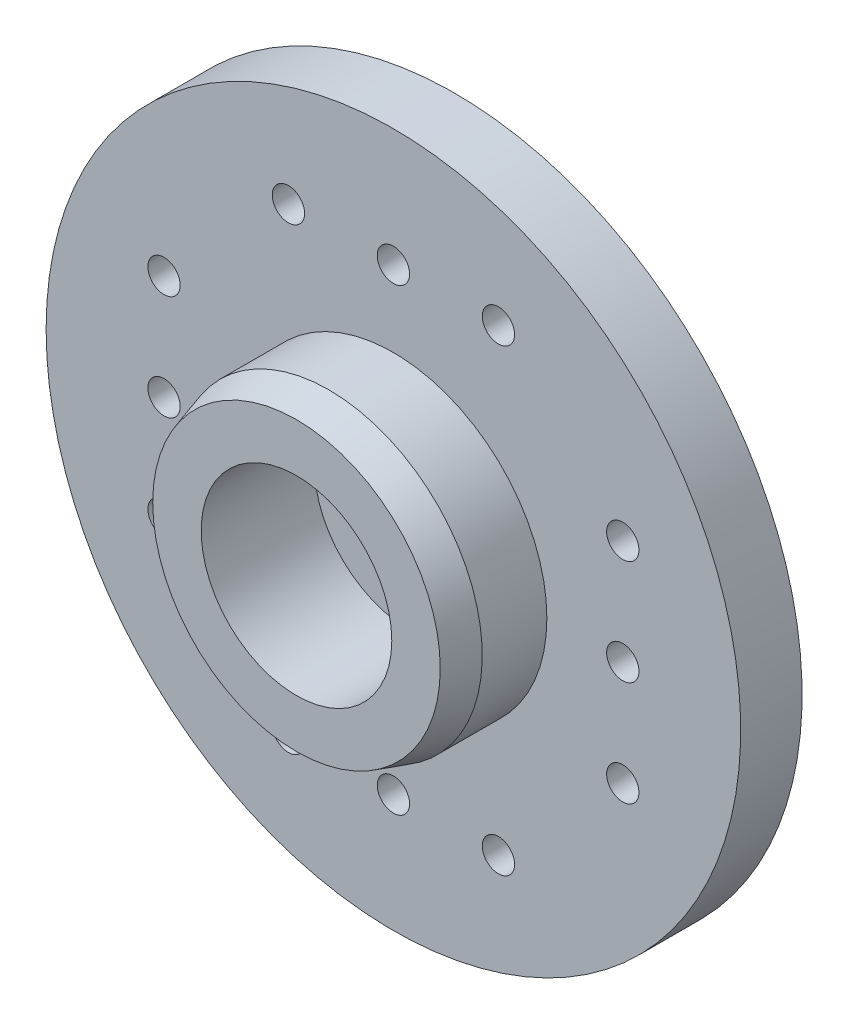
ISO-10303-21;
HEADER;
FILE_DESCRIPTION(('STEP AP214'),'2;1');
FILE_NAME('part.step','',(''),(''),'','','');
FILE_SCHEMA(('AUTOMOTIVE_DESIGN { 1 0 10303 214 1 1 1 1 }'));
ENDSEC;
DATA;
#1=APPLICATION_CONTEXT('core data for automotive mechanical design processes');
#2=APPLICATION_PROTOCOL_DEFINITION('international standard','automotive_design',2000,#1);
#3=PRODUCT_CONTEXT('',#1,'mechanical');
#4=PRODUCT('Part','Part','',(#3));
#5=PRODUCT_RELATED_PRODUCT_CATEGORY('part','',(#4));
#6=PRODUCT_DEFINITION_FORMATION('','',#4);
#7=PRODUCT_DEFINITION_CONTEXT('part definition',#1,'design');
#8=PRODUCT_DEFINITION('design','',#6,#7);
#9=PRODUCT_DEFINITION_SHAPE('','',#8);
#10=(LENGTH_UNIT() NAMED_UNIT(*) SI_UNIT(.MILLI.,.METRE.));
#11=(NAMED_UNIT(*) PLANE_ANGLE_UNIT() SI_UNIT($,.RADIAN.));
#12=(NAMED_UNIT(*) SI_UNIT($,.STERADIAN.) SOLID_ANGLE_UNIT());
#13=UNCERTAINTY_MEASURE_WITH_UNIT(LENGTH_MEASURE(1.E-05),#10,'distance_accuracy_value','');
#14=(GEOMETRIC_REPRESENTATION_CONTEXT(3) GLOBAL_UNCERTAINTY_ASSIGNED_CONTEXT((#13)) GLOBAL_UNIT_ASSIGNED_CONTEXT((#10,
#11,#12)) REPRESENTATION_CONTEXT('',''));
#15=CARTESIAN_POINT('',(0.,0.,0.));
#16=DIRECTION('',(0.,0.,1.));
#17=DIRECTION('',(1.,0.,0.));
#18=AXIS2_PLACEMENT_3D('',#15,#16,#17);
#19=CARTESIAN_POINT('',(0.,0.,4.9));
#20=DIRECTION('',(0.,0.,-1.));
#21=DIRECTION('',(-1.,0.,0.));
#22=AXIS2_PLACEMENT_3D('',#19,#20,#21);
#23=CYLINDRICAL_SURFACE('',#22,1.45);
#24=CARTESIAN_POINT('',(0.,0.,1.4));
#25=DIRECTION('',(0.,0.,-1.));
#26=DIRECTION('',(-1.,0.,0.));
#27=AXIS2_PLACEMENT_3D('',#24,#25,#26);
#28=CIRCLE('',#27,1.45);
#29=CARTESIAN_POINT('',(-1.45,0.,1.4));
#30=VERTEX_POINT('',#29);
#31=EDGE_CURVE('E18',#30,#30,#28,.T.);
#32=ORIENTED_EDGE('',*,*,#31,.F.);
#33=EDGE_LOOP('',(#32));
#34=FACE_BOUND('',#33,.T.);
#35=CARTESIAN_POINT('',(0.,0.,0.));
#36=DIRECTION('',(0.,0.,-1.));
#37=DIRECTION('',(-1.,0.,0.));
#38=AXIS2_PLACEMENT_3D('',#35,#36,#37);
#39=CIRCLE('',#38,1.45);
#40=CARTESIAN_POINT('',(-1.45,0.,0.));
#41=VERTEX_POINT('',#40);
#42=EDGE_CURVE('E132',#41,#41,#39,.T.);
#43=ORIENTED_EDGE('',*,*,#42,.T.);
#44=EDGE_LOOP('',(#43));
#45=FACE_BOUND('',#44,.T.);
#46=ADVANCED_FACE('F15',(#34,#45),#23,.F.);
#47=CARTESIAN_POINT('',(0.,0.,1.4));
#48=DIRECTION('',(0.,0.,1.));
#49=DIRECTION('',(1.,0.,0.));
#50=AXIS2_PLACEMENT_3D('',#47,#48,#49);
#51=PLANE('',#50);
#52=CARTESIAN_POINT('',(0.,0.,1.4));
#53=DIRECTION('',(0.,0.,1.));
#54=DIRECTION('',(1.,0.,0.));
#55=AXIS2_PLACEMENT_3D('',#52,#53,#54);
#56=CIRCLE('',#55,2.95);
#57=CARTESIAN_POINT('',(2.95,0.,1.4));
#58=VERTEX_POINT('',#57);
#59=EDGE_CURVE('E130',#58,#58,#56,.T.);
#60=ORIENTED_EDGE('',*,*,#59,.T.);
#61=EDGE_LOOP('',(#60));
#62=FACE_BOUND('',#61,.T.);
#63=ORIENTED_EDGE('',*,*,#31,.T.);
#64=EDGE_LOOP('',(#63));
#65=FACE_BOUND('',#64,.T.);
#66=ADVANCED_FACE('F139',(#62,#65),#51,.T.);
#67=CARTESIAN_POINT('',(0.,0.,0.));
#68=DIRECTION('',(0.,0.,1.));
#69=DIRECTION('',(1.,0.,0.));
#70=AXIS2_PLACEMENT_3D('',#67,#68,#69);
#71=PLANE('',#70);
#72=CARTESIAN_POINT('',(0.,0.,0.));
#73=DIRECTION('',(0.,0.,1.));
#74=DIRECTION('',(1.,0.,0.));
#75=AXIS2_PLACEMENT_3D('',#72,#73,#74);
#76=CIRCLE('',#75,2.75);
#77=CARTESIAN_POINT('',(2.75,0.,0.));
#78=VERTEX_POINT('',#77);
#79=EDGE_CURVE('E127',#78,#78,#76,.F.);
#80=ORIENTED_EDGE('',*,*,#79,.T.);
#81=EDGE_LOOP('',(#80));
#82=FACE_BOUND('',#81,.T.);
#83=ORIENTED_EDGE('',*,*,#42,.F.);
#84=EDGE_LOOP('',(#83));
#85=FACE_BOUND('',#84,.T.);
#86=ADVANCED_FACE('F146',(#82,#85),#71,.F.);
#87=CARTESIAN_POINT('',(0.,0.,1.4));
#88=DIRECTION('',(0.,0.,1.));
#89=DIRECTION('',(1.,0.,0.));
#90=AXIS2_PLACEMENT_3D('',#87,#88,#89);
#91=CYLINDRICAL_SURFACE('',#90,2.95);
#92=CARTESIAN_POINT('',(0.,0.,4.9));
#93=DIRECTION('',(0.,0.,1.));
#94=DIRECTION('',(1.,0.,0.));
#95=AXIS2_PLACEMENT_3D('',#92,#93,#94);
#96=CIRCLE('',#95,2.95);
#97=CARTESIAN_POINT('',(2.95,0.,4.9));
#98=VERTEX_POINT('',#97);
#99=EDGE_CURVE('E124',#98,#98,#96,.F.);
#100=ORIENTED_EDGE('',*,*,#99,.F.);
#101=EDGE_LOOP('',(#100));
#102=FACE_BOUND('',#101,.T.);
#103=ORIENTED_EDGE('',*,*,#59,.F.);
#104=EDGE_LOOP('',(#103));
#105=FACE_BOUND('',#104,.T.);
#106=ADVANCED_FACE('F242',(#102,#105),#91,.F.);
#107=CARTESIAN_POINT('',(0.,0.,-1.));
#108=DIRECTION('',(0.,0.,1.));
#109=DIRECTION('',(1.,0.,0.));
#110=AXIS2_PLACEMENT_3D('',#107,#108,#109);
#111=CYLINDRICAL_SURFACE('',#110,2.75);
#112=CARTESIAN_POINT('',(0.,0.,-1.));
#113=DIRECTION('',(0.,0.,1.));
#114=DIRECTION('',(1.,0.,0.));
#115=AXIS2_PLACEMENT_3D('',#112,#113,#114);
#116=CIRCLE('',#115,2.75);
#117=CARTESIAN_POINT('',(2.75,0.,-1.));
#118=VERTEX_POINT('',#117);
#119=EDGE_CURVE('E121',#118,#118,#116,.T.);
#120=ORIENTED_EDGE('',*,*,#119,.F.);
#121=EDGE_LOOP('',(#120));
#122=FACE_BOUND('',#121,.T.);
#123=ORIENTED_EDGE('',*,*,#79,.F.);
#124=EDGE_LOOP('',(#123));
#125=FACE_BOUND('',#124,.T.);
#126=ADVANCED_FACE('F238',(#122,#125),#111,.F.);
#127=CARTESIAN_POINT('',(0.,0.,4.9));
#128=DIRECTION('',(0.,0.,1.));
#129=DIRECTION('',(1.,0.,0.));
#130=AXIS2_PLACEMENT_3D('',#127,#128,#129);
#131=PLANE('',#130);
#132=CARTESIAN_POINT('',(0.,0.,4.89999999996371));
#133=DIRECTION('',(0.,0.,-1.));
#134=DIRECTION('',(0.,1.,0.));
#135=AXIS2_PLACEMENT_3D('',#132,#133,#134);
#136=CIRCLE('',#135,4.44999999999141);
#137=CARTESIAN_POINT('',(0.,4.44999999999141,4.89999999996371));
#138=VERTEX_POINT('',#137);
#139=EDGE_CURVE('E118',#138,#138,#136,.T.);
#140=ORIENTED_EDGE('',*,*,#139,.F.);
#141=EDGE_LOOP('',(#140));
#142=FACE_BOUND('',#141,.T.);
#143=ORIENTED_EDGE('',*,*,#99,.T.);
#144=EDGE_LOOP('',(#143));
#145=FACE_BOUND('',#144,.T.);
#146=ADVANCED_FACE('F234',(#142,#145),#131,.T.);
#147=CARTESIAN_POINT('',(0.,0.,-1.));
#148=DIRECTION('',(0.,0.,-1.));
#149=DIRECTION('',(-1.,0.,0.));
#150=AXIS2_PLACEMENT_3D('',#147,#148,#149);
#151=PLANE('',#150);
#152=ORIENTED_EDGE('',*,*,#119,.T.);
#153=EDGE_LOOP('',(#152));
#154=FACE_BOUND('',#153,.T.);
#155=CARTESIAN_POINT('',(0.,0.,-1.));
#156=DIRECTION('',(0.,0.,1.));
#157=DIRECTION('',(1.,0.,0.));
#158=AXIS2_PLACEMENT_3D('',#155,#156,#157);
#159=CIRCLE('',#158,3.25);
#160=CARTESIAN_POINT('',(3.25,0.,-1.));
#161=VERTEX_POINT('',#160);
#162=EDGE_CURVE('E115',#161,#161,#159,.T.);
#163=ORIENTED_EDGE('',*,*,#162,.F.);
#164=EDGE_LOOP('',(#163));
#165=FACE_BOUND('',#164,.T.);
#166=ADVANCED_FACE('F230',(#154,#165),#151,.T.);
#167=CARTESIAN_POINT('',(0.,0.,3.89999999998736));
#168=DIRECTION('',(0.,0.,-1.));
#169=DIRECTION('',(0.,1.,0.));
#170=AXIS2_PLACEMENT_3D('',#167,#168,#169);
#171=CONICAL_SURFACE('',#170,4.75000000000136,0.291456794493512);
#172=CARTESIAN_POINT('',(0.,0.,3.9));
#173=DIRECTION('',(0.,0.,-1.));
#174=DIRECTION('',(-1.,0.,0.));
#175=AXIS2_PLACEMENT_3D('',#172,#173,#174);
#176=CIRCLE('',#175,4.75);
#177=CARTESIAN_POINT('',(-4.75,0.,3.9));
#178=VERTEX_POINT('',#177);
#179=EDGE_CURVE('E30',#178,#178,#176,.T.);
#180=ORIENTED_EDGE('',*,*,#179,.F.);
#181=EDGE_LOOP('',(#180));
#182=FACE_BOUND('',#181,.T.);
#183=ORIENTED_EDGE('',*,*,#139,.T.);
#184=EDGE_LOOP('',(#183));
#185=FACE_BOUND('',#184,.T.);
#186=ADVANCED_FACE('F226',(#182,#185),#171,.T.);
#187=CARTESIAN_POINT('',(0.,0.,-1.));
#188=DIRECTION('',(0.,0.,1.));
#189=DIRECTION('',(1.,0.,0.));
#190=AXIS2_PLACEMENT_3D('',#187,#188,#189);
#191=CYLINDRICAL_SURFACE('',#190,3.25);
#192=CARTESIAN_POINT('',(0.,0.,0.4));
#193=DIRECTION('',(0.,0.,1.));
#194=DIRECTION('',(1.,0.,0.));
#195=AXIS2_PLACEMENT_3D('',#192,#193,#194);
#196=CIRCLE('',#195,3.25);
#197=CARTESIAN_POINT('',(3.25,0.,0.4));
#198=VERTEX_POINT('',#197);
#199=EDGE_CURVE('E112',#198,#198,#196,.T.);
#200=ORIENTED_EDGE('',*,*,#199,.F.);
#201=EDGE_LOOP('',(#200));
#202=FACE_BOUND('',#201,.T.);
#203=ORIENTED_EDGE('',*,*,#162,.T.);
#204=EDGE_LOOP('',(#203));
#205=FACE_BOUND('',#204,.T.);
#206=ADVANCED_FACE('F222',(#202,#205),#191,.T.);
#207=CARTESIAN_POINT('',(0.,0.,4.9));
#208=DIRECTION('',(0.,0.,-1.));
#209=DIRECTION('',(-1.,0.,0.));
#210=AXIS2_PLACEMENT_3D('',#207,#208,#209);
#211=CYLINDRICAL_SURFACE('',#210,4.75);
#212=CARTESIAN_POINT('',(0.,0.,1.9));
#213=DIRECTION('',(0.,0.,-1.));
#214=DIRECTION('',(-1.,0.,0.));
#215=AXIS2_PLACEMENT_3D('',#212,#213,#214);
#216=CIRCLE('',#215,4.75);
#217=CARTESIAN_POINT('',(-4.75,0.,1.9));
#218=VERTEX_POINT('',#217);
#219=EDGE_CURVE('E109',#218,#218,#216,.T.);
#220=ORIENTED_EDGE('',*,*,#219,.F.);
#221=EDGE_LOOP('',(#220));
#222=FACE_BOUND('',#221,.T.);
#223=ORIENTED_EDGE('',*,*,#179,.T.);
#224=EDGE_LOOP('',(#223));
#225=FACE_BOUND('',#224,.T.);
#226=ADVANCED_FACE('F218',(#222,#225),#211,.T.);
#227=CARTESIAN_POINT('',(0.,0.,0.4));
#228=DIRECTION('',(0.,0.,-1.));
#229=DIRECTION('',(-1.,0.,0.));
#230=AXIS2_PLACEMENT_3D('',#227,#228,#229);
#231=PLANE('',#230);
#232=CARTESIAN_POINT('',(0.,0.,0.4));
#233=DIRECTION('',(0.,0.,-1.));
#234=DIRECTION('',(-1.,0.,0.));
#235=AXIS2_PLACEMENT_3D('',#232,#233,#234);
#236=CIRCLE('',#235,4.25);
#237=CARTESIAN_POINT('',(-4.25,0.,0.4));
#238=VERTEX_POINT('',#237);
#239=EDGE_CURVE('E106',#238,#238,#236,.T.);
#240=ORIENTED_EDGE('',*,*,#239,.T.);
#241=EDGE_LOOP('',(#240));
#242=FACE_BOUND('',#241,.T.);
#243=ORIENTED_EDGE('',*,*,#199,.T.);
#244=EDGE_LOOP('',(#243));
#245=FACE_BOUND('',#244,.T.);
#246=ADVANCED_FACE('F214',(#242,#245),#231,.T.);
#247=CARTESIAN_POINT('',(0.,0.,1.9));
#248=DIRECTION('',(0.,0.,1.));
#249=DIRECTION('',(1.,0.,0.));
#250=AXIS2_PLACEMENT_3D('',#247,#248,#249);
#251=PLANE('',#250);
#252=ORIENTED_EDGE('',*,*,#219,.T.);
#253=EDGE_LOOP('',(#252));
#254=FACE_BOUND('',#253,.T.);
#255=CARTESIAN_POINT('',(-7.09999999999931,-5.14309428378815E-13,1.9));
#256=DIRECTION('',(0.,0.,-1.));
#257=DIRECTION('',(-1.,0.,0.));
#258=AXIS2_PLACEMENT_3D('',#255,#256,#257);
#259=CIRCLE('',#258,0.5);
#260=CARTESIAN_POINT('',(-7.59999999999931,-5.14309428378815E-13,1.9));
#261=VERTEX_POINT('',#260);
#262=EDGE_CURVE('E103',#261,#261,#259,.T.);
#263=ORIENTED_EDGE('',*,*,#262,.T.);
#264=EDGE_LOOP('',(#263));
#265=FACE_BOUND('',#264,.T.);
#266=CARTESIAN_POINT('',(-3.24999999999879,-7.09999999999982,1.9));
#267=DIRECTION('',(0.,0.,-1.));
#268=DIRECTION('',(-1.,0.,0.));
#269=AXIS2_PLACEMENT_3D('',#266,#267,#268);
#270=CIRCLE('',#269,0.5);
#271=CARTESIAN_POINT('',(-3.74999999999879,-7.09999999999982,1.9));
#272=VERTEX_POINT('',#271);
#273=EDGE_CURVE('E100',#272,#272,#270,.T.);
#274=ORIENTED_EDGE('',*,*,#273,.T.);
#275=EDGE_LOOP('',(#274));
#276=FACE_BOUND('',#275,.T.);
#277=CARTESIAN_POINT('',(3.25000000000121,-7.09999999999982,1.9));
#278=DIRECTION('',(0.,0.,-1.));
#279=DIRECTION('',(-1.,0.,0.));
#280=AXIS2_PLACEMENT_3D('',#277,#278,#279);
#281=CIRCLE('',#280,0.5);
#282=CARTESIAN_POINT('',(2.75000000000121,-7.09999999999982,1.9));
#283=VERTEX_POINT('',#282);
#284=EDGE_CURVE('E97',#283,#283,#281,.T.);
#285=ORIENTED_EDGE('',*,*,#284,.T.);
#286=EDGE_LOOP('',(#285));
#287=FACE_BOUND('',#286,.T.);
#288=CARTESIAN_POINT('',(7.10000000000051,6.95585894128985E-13,1.9));
#289=DIRECTION('',(0.,0.,-1.));
#290=DIRECTION('',(-1.,0.,0.));
#291=AXIS2_PLACEMENT_3D('',#288,#289,#290);
#292=CIRCLE('',#291,0.5);
#293=CARTESIAN_POINT('',(6.60000000000051,6.95585894128985E-13,1.9));
#294=VERTEX_POINT('',#293);
#295=EDGE_CURVE('E94',#294,#294,#292,.T.);
#296=ORIENTED_EDGE('',*,*,#295,.T.);
#297=EDGE_LOOP('',(#296));
#298=FACE_BOUND('',#297,.T.);
#299=CARTESIAN_POINT('',(3.25,7.1,1.9));
#300=DIRECTION('',(0.,0.,-1.));
#301=DIRECTION('',(-1.,0.,0.));
#302=AXIS2_PLACEMENT_3D('',#299,#300,#301);
#303=CIRCLE('',#302,0.5);
#304=CARTESIAN_POINT('',(2.75,7.1,1.9));
#305=VERTEX_POINT('',#304);
#306=EDGE_CURVE('E91',#305,#305,#303,.T.);
#307=ORIENTED_EDGE('',*,*,#306,.T.);
#308=EDGE_LOOP('',(#307));
#309=FACE_BOUND('',#308,.T.);
#310=CARTESIAN_POINT('',(-3.25,7.1,1.9));
#311=DIRECTION('',(0.,0.,-1.));
#312=DIRECTION('',(-1.,0.,0.));
#313=AXIS2_PLACEMENT_3D('',#310,#311,#312);
#314=CIRCLE('',#313,0.5);
#315=CARTESIAN_POINT('',(-3.75,7.1,1.9));
#316=VERTEX_POINT('',#315);
#317=EDGE_CURVE('E88',#316,#316,#314,.T.);
#318=ORIENTED_EDGE('',*,*,#317,.T.);
#319=EDGE_LOOP('',(#318));
#320=FACE_BOUND('',#319,.T.);
#321=CARTESIAN_POINT('',(0.,0.,1.9));
#322=DIRECTION('',(0.,0.,-1.));
#323=DIRECTION('',(-1.,0.,0.));
#324=AXIS2_PLACEMENT_3D('',#321,#322,#323);
#325=CIRCLE('',#324,10.75);
#326=CARTESIAN_POINT('',(-10.75,0.,1.9));
#327=VERTEX_POINT('',#326);
#328=EDGE_CURVE('E85',#327,#327,#325,.T.);
#329=ORIENTED_EDGE('',*,*,#328,.F.);
#330=EDGE_LOOP('',(#329));
#331=FACE_BOUND('',#330,.T.);
#332=CARTESIAN_POINT('',(0.,7.1,1.9));
#333=DIRECTION('',(0.,0.,-1.));
#334=DIRECTION('',(-1.,0.,0.));
#335=AXIS2_PLACEMENT_3D('',#332,#333,#334);
#336=CIRCLE('',#335,0.5);
#337=CARTESIAN_POINT('',(-0.5,7.1,1.9));
#338=VERTEX_POINT('',#337);
#339=EDGE_CURVE('E82',#338,#338,#336,.T.);
#340=ORIENTED_EDGE('',*,*,#339,.T.);
#341=EDGE_LOOP('',(#340));
#342=FACE_BOUND('',#341,.T.);
#343=CARTESIAN_POINT('',(7.10000000000051,3.2500000000007,1.9));
#344=DIRECTION('',(0.,0.,-1.));
#345=DIRECTION('',(-1.,0.,0.));
#346=AXIS2_PLACEMENT_3D('',#343,#344,#345);
#347=CIRCLE('',#346,0.5);
#348=CARTESIAN_POINT('',(6.60000000000051,3.2500000000007,1.9));
#349=VERTEX_POINT('',#348);
#350=EDGE_CURVE('E79',#349,#349,#347,.T.);
#351=ORIENTED_EDGE('',*,*,#350,.T.);
#352=EDGE_LOOP('',(#351));
#353=FACE_BOUND('',#352,.T.);
#354=CARTESIAN_POINT('',(7.10000000000051,-3.2499999999993,1.9));
#355=DIRECTION('',(0.,0.,-1.));
#356=DIRECTION('',(-1.,0.,0.));
#357=AXIS2_PLACEMENT_3D('',#354,#355,#356);
#358=CIRCLE('',#357,0.5);
#359=CARTESIAN_POINT('',(6.60000000000051,-3.2499999999993,1.9));
#360=VERTEX_POINT('',#359);
#361=EDGE_CURVE('E76',#360,#360,#358,.T.);
#362=ORIENTED_EDGE('',*,*,#361,.T.);
#363=EDGE_LOOP('',(#362));
#364=FACE_BOUND('',#363,.T.);
#365=CARTESIAN_POINT('',(1.20902582328041E-12,-7.09999999999982,1.9));
#366=DIRECTION('',(0.,0.,-1.));
#367=DIRECTION('',(-1.,0.,0.));
#368=AXIS2_PLACEMENT_3D('',#365,#366,#367);
#369=CIRCLE('',#368,0.5);
#370=CARTESIAN_POINT('',(-0.499999999998791,-7.09999999999982,1.9));
#371=VERTEX_POINT('',#370);
#372=EDGE_CURVE('E73',#371,#371,#369,.T.);
#373=ORIENTED_EDGE('',*,*,#372,.T.);
#374=EDGE_LOOP('',(#373));
#375=FACE_BOUND('',#374,.T.);
#376=CARTESIAN_POINT('',(-7.0999999999993,-3.25000000000051,1.9));
#377=DIRECTION('',(0.,0.,-1.));
#378=DIRECTION('',(-1.,0.,0.));
#379=AXIS2_PLACEMENT_3D('',#376,#377,#378);
#380=CIRCLE('',#379,0.5);
#381=CARTESIAN_POINT('',(-7.5999999999993,-3.25000000000051,1.9));
#382=VERTEX_POINT('',#381);
#383=EDGE_CURVE('E70',#382,#382,#380,.T.);
#384=ORIENTED_EDGE('',*,*,#383,.T.);
#385=EDGE_LOOP('',(#384));
#386=FACE_BOUND('',#385,.T.);
#387=CARTESIAN_POINT('',(-7.09999999999931,3.24999999999949,1.9));
#388=DIRECTION('',(0.,0.,-1.));
#389=DIRECTION('',(-1.,0.,0.));
#390=AXIS2_PLACEMENT_3D('',#387,#388,#389);
#391=CIRCLE('',#390,0.5);
#392=CARTESIAN_POINT('',(-7.59999999999931,3.24999999999949,1.9));
#393=VERTEX_POINT('',#392);
#394=EDGE_CURVE('E67',#393,#393,#391,.T.);
#395=ORIENTED_EDGE('',*,*,#394,.T.);
#396=EDGE_LOOP('',(#395));
#397=FACE_BOUND('',#396,.T.);
#398=ADVANCED_FACE('F210',(#254,#265,#276,#287,#298,#309,#320,#331,#342,#353,#364,#375,#386,
#397),#251,.T.);
#399=CARTESIAN_POINT('',(0.,0.,0.4));
#400=DIRECTION('',(0.,0.,-1.));
#401=DIRECTION('',(-1.,0.,0.));
#402=AXIS2_PLACEMENT_3D('',#399,#400,#401);
#403=CYLINDRICAL_SURFACE('',#402,4.25);
#404=ORIENTED_EDGE('',*,*,#239,.F.);
#405=EDGE_LOOP('',(#404));
#406=FACE_BOUND('',#405,.T.);
#407=CARTESIAN_POINT('',(0.,0.,0.));
#408=DIRECTION('',(0.,0.,-1.));
#409=DIRECTION('',(-1.,0.,0.));
#410=AXIS2_PLACEMENT_3D('',#407,#408,#409);
#411=CIRCLE('',#410,4.25);
#412=CARTESIAN_POINT('',(-4.25,0.,0.));
#413=VERTEX_POINT('',#412);
#414=EDGE_CURVE('E64',#413,#413,#411,.T.);
#415=ORIENTED_EDGE('',*,*,#414,.T.);
#416=EDGE_LOOP('',(#415));
#417=FACE_BOUND('',#416,.T.);
#418=ADVANCED_FACE('F206',(#406,#417),#403,.F.);
#419=CARTESIAN_POINT('',(-7.09999999999931,-5.14309428378815E-13,1.9));
#420=DIRECTION('',(0.,0.,-1.));
#421=DIRECTION('',(-1.,0.,0.));
#422=AXIS2_PLACEMENT_3D('',#419,#420,#421);
#423=CYLINDRICAL_SURFACE('',#422,0.5);
#424=CARTESIAN_POINT('',(-7.09999999999931,-5.14309428378815E-13,0.));
#425=DIRECTION('',(0.,0.,-1.));
#426=DIRECTION('',(-1.,0.,0.));
#427=AXIS2_PLACEMENT_3D('',#424,#425,#426);
#428=CIRCLE('',#427,0.5);
#429=CARTESIAN_POINT('',(-7.59999999999931,-5.14309428378815E-13,0.));
#430=VERTEX_POINT('',#429);
#431=EDGE_CURVE('E61',#430,#430,#428,.T.);
#432=ORIENTED_EDGE('',*,*,#431,.T.);
#433=EDGE_LOOP('',(#432));
#434=FACE_BOUND('',#433,.T.);
#435=ORIENTED_EDGE('',*,*,#262,.F.);
#436=EDGE_LOOP('',(#435));
#437=FACE_BOUND('',#436,.T.);
#438=ADVANCED_FACE('F202',(#434,#437),#423,.F.);
#439=CARTESIAN_POINT('',(-3.24999999999879,-7.09999999999982,1.9));
#440=DIRECTION('',(0.,0.,-1.));
#441=DIRECTION('',(-1.,0.,0.));
#442=AXIS2_PLACEMENT_3D('',#439,#440,#441);
#443=CYLINDRICAL_SURFACE('',#442,0.5);
#444=CARTESIAN_POINT('',(-3.24999999999879,-7.09999999999982,0.));
#445=DIRECTION('',(0.,0.,-1.));
#446=DIRECTION('',(-1.,0.,0.));
#447=AXIS2_PLACEMENT_3D('',#444,#445,#446);
#448=CIRCLE('',#447,0.5);
#449=CARTESIAN_POINT('',(-3.74999999999879,-7.09999999999982,0.));
#450=VERTEX_POINT('',#449);
#451=EDGE_CURVE('E58',#450,#450,#448,.T.);
#452=ORIENTED_EDGE('',*,*,#451,.T.);
#453=EDGE_LOOP('',(#452));
#454=FACE_BOUND('',#453,.T.);
#455=ORIENTED_EDGE('',*,*,#273,.F.);
#456=EDGE_LOOP('',(#455));
#457=FACE_BOUND('',#456,.T.);
#458=ADVANCED_FACE('F198',(#454,#457),#443,.F.);
#459=CARTESIAN_POINT('',(3.25000000000121,-7.09999999999982,1.9));
#460=DIRECTION('',(0.,0.,-1.));
#461=DIRECTION('',(-1.,0.,0.));
#462=AXIS2_PLACEMENT_3D('',#459,#460,#461);
#463=CYLINDRICAL_SURFACE('',#462,0.5);
#464=CARTESIAN_POINT('',(3.25000000000121,-7.09999999999982,0.));
#465=DIRECTION('',(0.,0.,-1.));
#466=DIRECTION('',(-1.,0.,0.));
#467=AXIS2_PLACEMENT_3D('',#464,#465,#466);
#468=CIRCLE('',#467,0.5);
#469=CARTESIAN_POINT('',(2.75000000000121,-7.09999999999982,0.));
#470=VERTEX_POINT('',#469);
#471=EDGE_CURVE('E55',#470,#470,#468,.T.);
#472=ORIENTED_EDGE('',*,*,#471,.T.);
#473=EDGE_LOOP('',(#472));
#474=FACE_BOUND('',#473,.T.);
#475=ORIENTED_EDGE('',*,*,#284,.F.);
#476=EDGE_LOOP('',(#475));
#477=FACE_BOUND('',#476,.T.);
#478=ADVANCED_FACE('F194',(#474,#477),#463,.F.);
#479=CARTESIAN_POINT('',(7.10000000000051,6.95585894128985E-13,1.9));
#480=DIRECTION('',(0.,0.,-1.));
#481=DIRECTION('',(-1.,0.,0.));
#482=AXIS2_PLACEMENT_3D('',#479,#480,#481);
#483=CYLINDRICAL_SURFACE('',#482,0.5);
#484=CARTESIAN_POINT('',(7.10000000000051,6.95585894128985E-13,0.));
#485=DIRECTION('',(0.,0.,-1.));
#486=DIRECTION('',(-1.,0.,0.));
#487=AXIS2_PLACEMENT_3D('',#484,#485,#486);
#488=CIRCLE('',#487,0.5);
#489=CARTESIAN_POINT('',(6.60000000000051,6.95585894128985E-13,0.));
#490=VERTEX_POINT('',#489);
#491=EDGE_CURVE('E52',#490,#490,#488,.T.);
#492=ORIENTED_EDGE('',*,*,#491,.T.);
#493=EDGE_LOOP('',(#492));
#494=FACE_BOUND('',#493,.T.);
#495=ORIENTED_EDGE('',*,*,#295,.F.);
#496=EDGE_LOOP('',(#495));
#497=FACE_BOUND('',#496,.T.);
#498=ADVANCED_FACE('F190',(#494,#497),#483,.F.);
#499=CARTESIAN_POINT('',(3.25,7.1,1.9));
#500=DIRECTION('',(0.,0.,-1.));
#501=DIRECTION('',(-1.,0.,0.));
#502=AXIS2_PLACEMENT_3D('',#499,#500,#501);
#503=CYLINDRICAL_SURFACE('',#502,0.5);
#504=CARTESIAN_POINT('',(3.25,7.1,0.));
#505=DIRECTION('',(0.,0.,-1.));
#506=DIRECTION('',(-1.,0.,0.));
#507=AXIS2_PLACEMENT_3D('',#504,#505,#506);
#508=CIRCLE('',#507,0.5);
#509=CARTESIAN_POINT('',(2.75,7.1,0.));
#510=VERTEX_POINT('',#509);
#511=EDGE_CURVE('E49',#510,#510,#508,.T.);
#512=ORIENTED_EDGE('',*,*,#511,.T.);
#513=EDGE_LOOP('',(#512));
#514=FACE_BOUND('',#513,.T.);
#515=ORIENTED_EDGE('',*,*,#306,.F.);
#516=EDGE_LOOP('',(#515));
#517=FACE_BOUND('',#516,.T.);
#518=ADVANCED_FACE('F186',(#514,#517),#503,.F.);
#519=CARTESIAN_POINT('',(-3.25,7.1,1.9));
#520=DIRECTION('',(0.,0.,-1.));
#521=DIRECTION('',(-1.,0.,0.));
#522=AXIS2_PLACEMENT_3D('',#519,#520,#521);
#523=CYLINDRICAL_SURFACE('',#522,0.5);
#524=CARTESIAN_POINT('',(-3.25,7.1,0.));
#525=DIRECTION('',(0.,0.,-1.));
#526=DIRECTION('',(-1.,0.,0.));
#527=AXIS2_PLACEMENT_3D('',#524,#525,#526);
#528=CIRCLE('',#527,0.5);
#529=CARTESIAN_POINT('',(-3.75,7.1,0.));
#530=VERTEX_POINT('',#529);
#531=EDGE_CURVE('E46',#530,#530,#528,.T.);
#532=ORIENTED_EDGE('',*,*,#531,.T.);
#533=EDGE_LOOP('',(#532));
#534=FACE_BOUND('',#533,.T.);
#535=ORIENTED_EDGE('',*,*,#317,.F.);
#536=EDGE_LOOP('',(#535));
#537=FACE_BOUND('',#536,.T.);
#538=ADVANCED_FACE('F182',(#534,#537),#523,.F.);
#539=CARTESIAN_POINT('',(0.,0.,1.9));
#540=DIRECTION('',(0.,0.,-1.));
#541=DIRECTION('',(-1.,0.,0.));
#542=AXIS2_PLACEMENT_3D('',#539,#540,#541);
#543=CYLINDRICAL_SURFACE('',#542,10.75);
#544=ORIENTED_EDGE('',*,*,#328,.T.);
#545=EDGE_LOOP('',(#544));
#546=FACE_BOUND('',#545,.T.);
#547=CARTESIAN_POINT('',(0.,0.,0.));
#548=DIRECTION('',(0.,0.,-1.));
#549=DIRECTION('',(-1.,0.,0.));
#550=AXIS2_PLACEMENT_3D('',#547,#548,#549);
#551=CIRCLE('',#550,10.75);
#552=CARTESIAN_POINT('',(-10.75,0.,0.));
#553=VERTEX_POINT('',#552);
#554=EDGE_CURVE('E43',#553,#553,#551,.F.);
#555=ORIENTED_EDGE('',*,*,#554,.T.);
#556=EDGE_LOOP('',(#555));
#557=FACE_BOUND('',#556,.T.);
#558=ADVANCED_FACE('F178',(#546,#557),#543,.T.);
#559=CARTESIAN_POINT('',(0.,7.1,1.9));
#560=DIRECTION('',(0.,0.,-1.));
#561=DIRECTION('',(-1.,0.,0.));
#562=AXIS2_PLACEMENT_3D('',#559,#560,#561);
#563=CYLINDRICAL_SURFACE('',#562,0.5);
#564=CARTESIAN_POINT('',(0.,7.1,0.));
#565=DIRECTION('',(0.,0.,-1.));
#566=DIRECTION('',(-1.,0.,0.));
#567=AXIS2_PLACEMENT_3D('',#564,#565,#566);
#568=CIRCLE('',#567,0.5);
#569=CARTESIAN_POINT('',(-0.5,7.1,0.));
#570=VERTEX_POINT('',#569);
#571=EDGE_CURVE('E40',#570,#570,#568,.T.);
#572=ORIENTED_EDGE('',*,*,#571,.T.);
#573=EDGE_LOOP('',(#572));
#574=FACE_BOUND('',#573,.T.);
#575=ORIENTED_EDGE('',*,*,#339,.F.);
#576=EDGE_LOOP('',(#575));
#577=FACE_BOUND('',#576,.T.);
#578=ADVANCED_FACE('F174',(#574,#577),#563,.F.);
#579=CARTESIAN_POINT('',(7.10000000000051,3.2500000000007,1.9));
#580=DIRECTION('',(0.,0.,-1.));
#581=DIRECTION('',(-1.,0.,0.));
#582=AXIS2_PLACEMENT_3D('',#579,#580,#581);
#583=CYLINDRICAL_SURFACE('',#582,0.5);
#584=CARTESIAN_POINT('',(7.10000000000051,3.2500000000007,0.));
#585=DIRECTION('',(0.,0.,-1.));
#586=DIRECTION('',(-1.,0.,0.));
#587=AXIS2_PLACEMENT_3D('',#584,#585,#586);
#588=CIRCLE('',#587,0.5);
#589=CARTESIAN_POINT('',(6.60000000000051,3.2500000000007,0.));
#590=VERTEX_POINT('',#589);
#591=EDGE_CURVE('E37',#590,#590,#588,.T.);
#592=ORIENTED_EDGE('',*,*,#591,.T.);
#593=EDGE_LOOP('',(#592));
#594=FACE_BOUND('',#593,.T.);
#595=ORIENTED_EDGE('',*,*,#350,.F.);
#596=EDGE_LOOP('',(#595));
#597=FACE_BOUND('',#596,.T.);
#598=ADVANCED_FACE('F170',(#594,#597),#583,.F.);
#599=CARTESIAN_POINT('',(7.10000000000051,-3.2499999999993,1.9));
#600=DIRECTION('',(0.,0.,-1.));
#601=DIRECTION('',(-1.,0.,0.));
#602=AXIS2_PLACEMENT_3D('',#599,#600,#601);
#603=CYLINDRICAL_SURFACE('',#602,0.5);
#604=CARTESIAN_POINT('',(7.10000000000051,-3.2499999999993,0.));
#605=DIRECTION('',(0.,0.,-1.));
#606=DIRECTION('',(-1.,0.,0.));
#607=AXIS2_PLACEMENT_3D('',#604,#605,#606);
#608=CIRCLE('',#607,0.5);
#609=CARTESIAN_POINT('',(6.60000000000051,-3.2499999999993,0.));
#610=VERTEX_POINT('',#609);
#611=EDGE_CURVE('E34',#610,#610,#608,.T.);
#612=ORIENTED_EDGE('',*,*,#611,.T.);
#613=EDGE_LOOP('',(#612));
#614=FACE_BOUND('',#613,.T.);
#615=ORIENTED_EDGE('',*,*,#361,.F.);
#616=EDGE_LOOP('',(#615));
#617=FACE_BOUND('',#616,.T.);
#618=ADVANCED_FACE('F166',(#614,#617),#603,.F.);
#619=CARTESIAN_POINT('',(1.20902582328041E-12,-7.09999999999982,1.9));
#620=DIRECTION('',(0.,0.,-1.));
#621=DIRECTION('',(-1.,0.,0.));
#622=AXIS2_PLACEMENT_3D('',#619,#620,#621);
#623=CYLINDRICAL_SURFACE('',#622,0.5);
#624=CARTESIAN_POINT('',(1.20902582328041E-12,-7.09999999999982,0.));
#625=DIRECTION('',(0.,0.,-1.));
#626=DIRECTION('',(-1.,0.,0.));
#627=AXIS2_PLACEMENT_3D('',#624,#625,#626);
#628=CIRCLE('',#627,0.5);
#629=CARTESIAN_POINT('',(-0.499999999998791,-7.09999999999982,0.));
#630=VERTEX_POINT('',#629);
#631=EDGE_CURVE('E27',#630,#630,#628,.T.);
#632=ORIENTED_EDGE('',*,*,#631,.T.);
#633=EDGE_LOOP('',(#632));
#634=FACE_BOUND('',#633,.T.);
#635=ORIENTED_EDGE('',*,*,#372,.F.);
#636=EDGE_LOOP('',(#635));
#637=FACE_BOUND('',#636,.T.);
#638=ADVANCED_FACE('F162',(#634,#637),#623,.F.);
#639=CARTESIAN_POINT('',(-7.0999999999993,-3.25000000000051,1.9));
#640=DIRECTION('',(0.,0.,-1.));
#641=DIRECTION('',(-1.,0.,0.));
#642=AXIS2_PLACEMENT_3D('',#639,#640,#641);
#643=CYLINDRICAL_SURFACE('',#642,0.5);
#644=CARTESIAN_POINT('',(-7.0999999999993,-3.25000000000051,0.));
#645=DIRECTION('',(0.,0.,-1.));
#646=DIRECTION('',(-1.,0.,0.));
#647=AXIS2_PLACEMENT_3D('',#644,#645,#646);
#648=CIRCLE('',#647,0.5);
#649=CARTESIAN_POINT('',(-7.5999999999993,-3.25000000000051,0.));
#650=VERTEX_POINT('',#649);
#651=EDGE_CURVE('E22',#650,#650,#648,.T.);
#652=ORIENTED_EDGE('',*,*,#651,.T.);
#653=EDGE_LOOP('',(#652));
#654=FACE_BOUND('',#653,.T.);
#655=ORIENTED_EDGE('',*,*,#383,.F.);
#656=EDGE_LOOP('',(#655));
#657=FACE_BOUND('',#656,.T.);
#658=ADVANCED_FACE('F156',(#654,#657),#643,.F.);
#659=CARTESIAN_POINT('',(-7.09999999999931,3.24999999999949,1.9));
#660=DIRECTION('',(0.,0.,-1.));
#661=DIRECTION('',(-1.,0.,0.));
#662=AXIS2_PLACEMENT_3D('',#659,#660,#661);
#663=CYLINDRICAL_SURFACE('',#662,0.5);
#664=CARTESIAN_POINT('',(-7.09999999999931,3.24999999999949,0.));
#665=DIRECTION('',(0.,0.,-1.));
#666=DIRECTION('',(-1.,0.,0.));
#667=AXIS2_PLACEMENT_3D('',#664,#665,#666);
#668=CIRCLE('',#667,0.5);
#669=CARTESIAN_POINT('',(-7.59999999999931,3.24999999999949,0.));
#670=VERTEX_POINT('',#669);
#671=EDGE_CURVE('E10',#670,#670,#668,.T.);
#672=ORIENTED_EDGE('',*,*,#671,.T.);
#673=EDGE_LOOP('',(#672));
#674=FACE_BOUND('',#673,.T.);
#675=ORIENTED_EDGE('',*,*,#394,.F.);
#676=EDGE_LOOP('',(#675));
#677=FACE_BOUND('',#676,.T.);
#678=ADVANCED_FACE('F150',(#674,#677),#663,.F.);
#679=CARTESIAN_POINT('',(0.,0.,0.));
#680=DIRECTION('',(0.,0.,1.));
#681=DIRECTION('',(1.,0.,0.));
#682=AXIS2_PLACEMENT_3D('',#679,#680,#681);
#683=PLANE('',#682);
#684=ORIENTED_EDGE('',*,*,#671,.F.);
#685=EDGE_LOOP('',(#684));
#686=FACE_BOUND('',#685,.T.);
#687=ORIENTED_EDGE('',*,*,#651,.F.);
#688=EDGE_LOOP('',(#687));
#689=FACE_BOUND('',#688,.T.);
#690=ORIENTED_EDGE('',*,*,#631,.F.);
#691=EDGE_LOOP('',(#690));
#692=FACE_BOUND('',#691,.T.);
#693=ORIENTED_EDGE('',*,*,#611,.F.);
#694=EDGE_LOOP('',(#693));
#695=FACE_BOUND('',#694,.T.);
#696=ORIENTED_EDGE('',*,*,#591,.F.);
#697=EDGE_LOOP('',(#696));
#698=FACE_BOUND('',#697,.T.);
#699=ORIENTED_EDGE('',*,*,#571,.F.);
#700=EDGE_LOOP('',(#699));
#701=FACE_BOUND('',#700,.T.);
#702=ORIENTED_EDGE('',*,*,#554,.F.);
#703=EDGE_LOOP('',(#702));
#704=FACE_BOUND('',#703,.T.);
#705=ORIENTED_EDGE('',*,*,#531,.F.);
#706=EDGE_LOOP('',(#705));
#707=FACE_BOUND('',#706,.T.);
#708=ORIENTED_EDGE('',*,*,#511,.F.);
#709=EDGE_LOOP('',(#708));
#710=FACE_BOUND('',#709,.T.);
#711=ORIENTED_EDGE('',*,*,#491,.F.);
#712=EDGE_LOOP('',(#711));
#713=FACE_BOUND('',#712,.T.);
#714=ORIENTED_EDGE('',*,*,#471,.F.);
#715=EDGE_LOOP('',(#714));
#716=FACE_BOUND('',#715,.T.);
#717=ORIENTED_EDGE('',*,*,#451,.F.);
#718=EDGE_LOOP('',(#717));
#719=FACE_BOUND('',#718,.T.);
#720=ORIENTED_EDGE('',*,*,#431,.F.);
#721=EDGE_LOOP('',(#720));
#722=FACE_BOUND('',#721,.T.);
#723=ORIENTED_EDGE('',*,*,#414,.F.);
#724=EDGE_LOOP('',(#723));
#725=FACE_BOUND('',#724,.T.);
#726=ADVANCED_FACE('F148',(#686,#689,#692,#695,#698,#701,#704,#707,#710,#713,#716,#719,#722,
#725),#683,.F.);
#727=CLOSED_SHELL('',(#46,#66,#86,#106,#126,#146,#166,#186,#206,#226,#246,#398,#418,#438,#458,
#478,#498,#518,#538,#558,#578,#598,#618,#638,#658,#678,#726));
#728=MANIFOLD_SOLID_BREP('B1',#727);
#729=ADVANCED_BREP_SHAPE_REPRESENTATION('',(#18,#728),#14);
#730=SHAPE_DEFINITION_REPRESENTATION(#9,#729);
ENDSEC;
END-ISO-10303-21;
